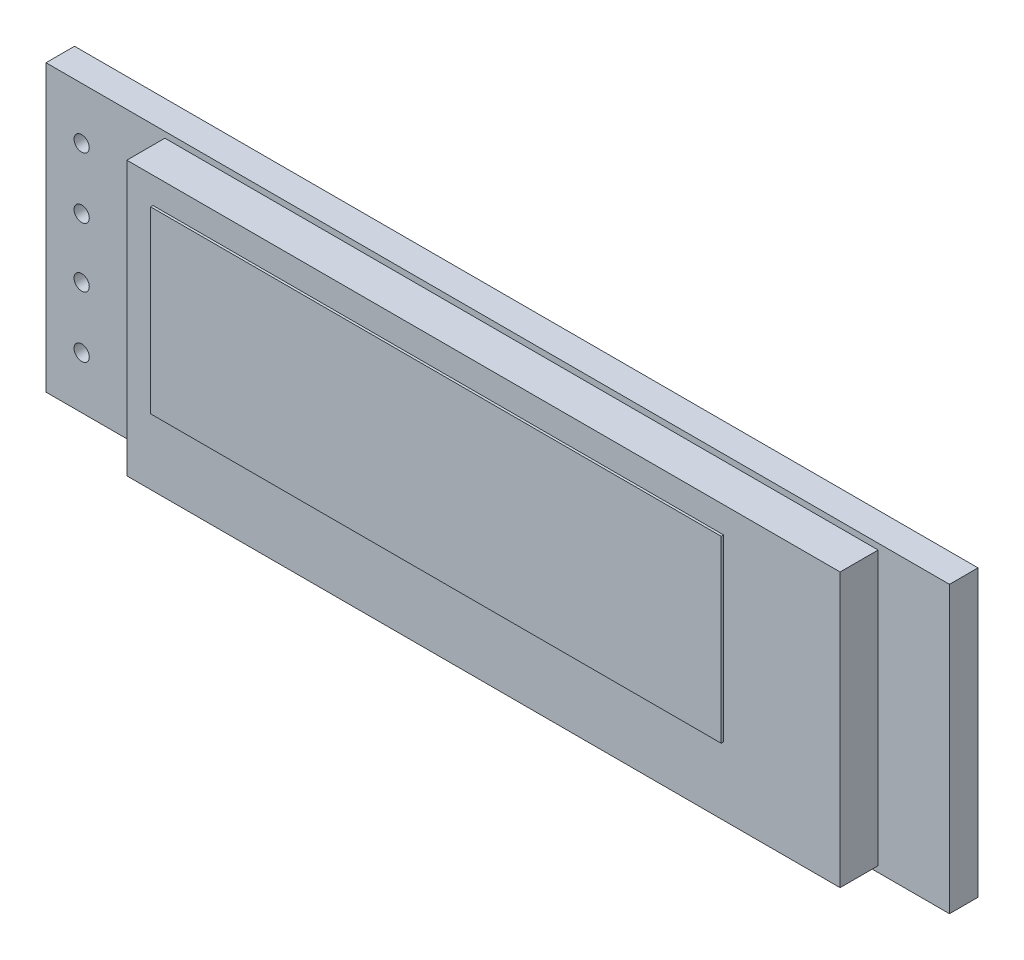
ISO-10303-21;
HEADER;
FILE_DESCRIPTION(('STEP AP214'),'2;1');
FILE_NAME('part.step','',(''),(''),'','','');
FILE_SCHEMA(('AUTOMOTIVE_DESIGN { 1 0 10303 214 1 1 1 1 }'));
ENDSEC;
DATA;
#1=APPLICATION_CONTEXT('core data for automotive mechanical design processes');
#2=APPLICATION_PROTOCOL_DEFINITION('international standard','automotive_design',2000,#1);
#3=PRODUCT_CONTEXT('',#1,'mechanical');
#4=PRODUCT('Part','Part','',(#3));
#5=PRODUCT_RELATED_PRODUCT_CATEGORY('part','',(#4));
#6=PRODUCT_DEFINITION_FORMATION('','',#4);
#7=PRODUCT_DEFINITION_CONTEXT('part definition',#1,'design');
#8=PRODUCT_DEFINITION('design','',#6,#7);
#9=PRODUCT_DEFINITION_SHAPE('','',#8);
#10=(LENGTH_UNIT() NAMED_UNIT(*) SI_UNIT(.MILLI.,.METRE.));
#11=(NAMED_UNIT(*) PLANE_ANGLE_UNIT() SI_UNIT($,.RADIAN.));
#12=(NAMED_UNIT(*) SI_UNIT($,.STERADIAN.) SOLID_ANGLE_UNIT());
#13=UNCERTAINTY_MEASURE_WITH_UNIT(LENGTH_MEASURE(1.E-05),#10,'distance_accuracy_value','');
#14=(GEOMETRIC_REPRESENTATION_CONTEXT(3) GLOBAL_UNCERTAINTY_ASSIGNED_CONTEXT((#13)) GLOBAL_UNIT_ASSIGNED_CONTEXT((#10,
#11,#12)) REPRESENTATION_CONTEXT('',''));
#15=CARTESIAN_POINT('',(0.,0.,0.));
#16=DIRECTION('',(0.,0.,1.));
#17=DIRECTION('',(1.,0.,0.));
#18=AXIS2_PLACEMENT_3D('',#15,#16,#17);
#19=CARTESIAN_POINT('',(0.,0.,2.8));
#20=DIRECTION('',(0.,0.,-1.));
#21=DIRECTION('',(-1.,0.,0.));
#22=AXIS2_PLACEMENT_3D('',#19,#20,#21);
#23=PLANE('',#22);
#24=DIRECTION('',(0.,1.,0.));
#25=VECTOR('',#24,1.);
#26=CARTESIAN_POINT('',(16.,-5.75,2.8));
#27=LINE('',#26,#25);
#28=CARTESIAN_POINT('',(16.,-5.75,2.8));
#29=VERTEX_POINT('',#28);
#30=CARTESIAN_POINT('',(16.,5.75,2.8));
#31=VERTEX_POINT('',#30);
#32=EDGE_CURVE('E165',#29,#31,#27,.T.);
#33=ORIENTED_EDGE('',*,*,#32,.T.);
#34=DIRECTION('',(-1.,0.,0.));
#35=VECTOR('',#34,1.);
#36=CARTESIAN_POINT('',(-14.,5.75,2.8));
#37=LINE('',#36,#35);
#38=CARTESIAN_POINT('',(-14.,5.75,2.8));
#39=VERTEX_POINT('',#38);
#40=EDGE_CURVE('E169',#31,#39,#37,.T.);
#41=ORIENTED_EDGE('',*,*,#40,.T.);
#42=DIRECTION('',(0.,-1.,0.));
#43=VECTOR('',#42,1.);
#44=CARTESIAN_POINT('',(-14.,-5.75,2.8));
#45=LINE('',#44,#43);
#46=CARTESIAN_POINT('',(-14.,-5.75,2.8));
#47=VERTEX_POINT('',#46);
#48=EDGE_CURVE('E173',#39,#47,#45,.T.);
#49=ORIENTED_EDGE('',*,*,#48,.T.);
#50=DIRECTION('',(1.,0.,0.));
#51=VECTOR('',#50,1.);
#52=CARTESIAN_POINT('',(-14.,-5.75,2.8));
#53=LINE('',#52,#51);
#54=EDGE_CURVE('E176',#47,#29,#53,.T.);
#55=ORIENTED_EDGE('',*,*,#54,.T.);
#56=EDGE_LOOP('',(#33,#41,#49,#55));
#57=FACE_BOUND('',#56,.T.);
#58=DIRECTION('',(0.,1.,0.));
#59=VECTOR('',#58,1.);
#60=CARTESIAN_POINT('',(11.1,4.65,2.8));
#61=LINE('',#60,#59);
#62=CARTESIAN_POINT('',(11.1,-2.89,2.8));
#63=VERTEX_POINT('',#62);
#64=CARTESIAN_POINT('',(11.1,4.65,2.8));
#65=VERTEX_POINT('',#64);
#66=EDGE_CURVE('E57',#63,#65,#61,.T.);
#67=ORIENTED_EDGE('',*,*,#66,.F.);
#68=DIRECTION('',(1.,0.,0.));
#69=VECTOR('',#68,1.);
#70=CARTESIAN_POINT('',(-12.9,-2.89,2.8));
#71=LINE('',#70,#69);
#72=CARTESIAN_POINT('',(-12.9,-2.89,2.8));
#73=VERTEX_POINT('',#72);
#74=EDGE_CURVE('E61',#73,#63,#71,.T.);
#75=ORIENTED_EDGE('',*,*,#74,.F.);
#76=DIRECTION('',(0.,-1.,0.));
#77=VECTOR('',#76,1.);
#78=CARTESIAN_POINT('',(-12.9,4.65,2.8));
#79=LINE('',#78,#77);
#80=CARTESIAN_POINT('',(-12.9,4.65,2.8));
#81=VERTEX_POINT('',#80);
#82=EDGE_CURVE('E488',#81,#73,#79,.T.);
#83=ORIENTED_EDGE('',*,*,#82,.F.);
#84=DIRECTION('',(-1.,0.,0.));
#85=VECTOR('',#84,1.);
#86=CARTESIAN_POINT('',(-12.9,4.65,2.8));
#87=LINE('',#86,#85);
#88=EDGE_CURVE('E453',#65,#81,#87,.T.);
#89=ORIENTED_EDGE('',*,*,#88,.F.);
#90=EDGE_LOOP('',(#67,#75,#83,#89));
#91=FACE_BOUND('',#90,.T.);
#92=ADVANCED_FACE('F41',(#57,#91),#23,.F.);
#93=CARTESIAN_POINT('',(-19.,-6.,1.2));
#94=DIRECTION('',(1.,0.,0.));
#95=DIRECTION('',(0.,0.,-1.));
#96=AXIS2_PLACEMENT_3D('',#93,#94,#95);
#97=PLANE('',#96);
#98=DIRECTION('',(0.,-1.,0.));
#99=VECTOR('',#98,1.);
#100=CARTESIAN_POINT('',(-19.,-6.,0.));
#101=LINE('',#100,#99);
#102=CARTESIAN_POINT('',(-19.,6.,0.));
#103=VERTEX_POINT('',#102);
#104=CARTESIAN_POINT('',(-19.,-6.,0.));
#105=VERTEX_POINT('',#104);
#106=EDGE_CURVE('E205',#103,#105,#101,.T.);
#107=ORIENTED_EDGE('',*,*,#106,.T.);
#108=DIRECTION('',(0.,0.,-1.));
#109=VECTOR('',#108,1.);
#110=CARTESIAN_POINT('',(-19.,-6.,1.2));
#111=LINE('',#110,#109);
#112=CARTESIAN_POINT('',(-19.,-6.,1.2));
#113=VERTEX_POINT('',#112);
#114=EDGE_CURVE('E11',#113,#105,#111,.T.);
#115=ORIENTED_EDGE('',*,*,#114,.F.);
#116=DIRECTION('',(0.,-1.,0.));
#117=VECTOR('',#116,1.);
#118=CARTESIAN_POINT('',(-19.,-6.,1.2));
#119=LINE('',#118,#117);
#120=CARTESIAN_POINT('',(-19.,6.,1.2));
#121=VERTEX_POINT('',#120);
#122=EDGE_CURVE('E206',#121,#113,#119,.T.);
#123=ORIENTED_EDGE('',*,*,#122,.F.);
#124=DIRECTION('',(0.,0.,-1.));
#125=VECTOR('',#124,1.);
#126=CARTESIAN_POINT('',(-19.,6.,1.2));
#127=LINE('',#126,#125);
#128=EDGE_CURVE('E220',#121,#103,#127,.T.);
#129=ORIENTED_EDGE('',*,*,#128,.T.);
#130=EDGE_LOOP('',(#107,#115,#123,#129));
#131=FACE_BOUND('',#130,.T.);
#132=ADVANCED_FACE('F43',(#131),#97,.F.);
#133=CARTESIAN_POINT('',(19.,-6.,1.2));
#134=DIRECTION('',(0.,1.,0.));
#135=DIRECTION('',(-1.,0.,0.));
#136=AXIS2_PLACEMENT_3D('',#133,#134,#135);
#137=PLANE('',#136);
#138=DIRECTION('',(1.,0.,0.));
#139=VECTOR('',#138,1.);
#140=CARTESIAN_POINT('',(19.,-6.,0.));
#141=LINE('',#140,#139);
#142=CARTESIAN_POINT('',(19.,-6.,0.));
#143=VERTEX_POINT('',#142);
#144=EDGE_CURVE('E224',#105,#143,#141,.T.);
#145=ORIENTED_EDGE('',*,*,#144,.T.);
#146=DIRECTION('',(0.,0.,-1.));
#147=VECTOR('',#146,1.);
#148=CARTESIAN_POINT('',(19.,-6.,1.2));
#149=LINE('',#148,#147);
#150=CARTESIAN_POINT('',(19.,-6.,1.2));
#151=VERTEX_POINT('',#150);
#152=EDGE_CURVE('E50',#151,#143,#149,.T.);
#153=ORIENTED_EDGE('',*,*,#152,.F.);
#154=DIRECTION('',(1.,0.,0.));
#155=VECTOR('',#154,1.);
#156=CARTESIAN_POINT('',(19.,-6.,1.2));
#157=LINE('',#156,#155);
#158=EDGE_CURVE('E210',#113,#151,#157,.T.);
#159=ORIENTED_EDGE('',*,*,#158,.F.);
#160=ORIENTED_EDGE('',*,*,#114,.T.);
#161=EDGE_LOOP('',(#145,#153,#159,#160));
#162=FACE_BOUND('',#161,.T.);
#163=ADVANCED_FACE('F260',(#162),#137,.F.);
#164=CARTESIAN_POINT('',(19.,-6.,1.2));
#165=DIRECTION('',(-1.,0.,0.));
#166=DIRECTION('',(0.,0.,1.));
#167=AXIS2_PLACEMENT_3D('',#164,#165,#166);
#168=PLANE('',#167);
#169=DIRECTION('',(0.,1.,0.));
#170=VECTOR('',#169,1.);
#171=CARTESIAN_POINT('',(19.,-6.,0.));
#172=LINE('',#171,#170);
#173=CARTESIAN_POINT('',(19.,6.,0.));
#174=VERTEX_POINT('',#173);
#175=EDGE_CURVE('E227',#143,#174,#172,.T.);
#176=ORIENTED_EDGE('',*,*,#175,.T.);
#177=DIRECTION('',(0.,0.,-1.));
#178=VECTOR('',#177,1.);
#179=CARTESIAN_POINT('',(19.,6.,1.2));
#180=LINE('',#179,#178);
#181=CARTESIAN_POINT('',(19.,6.,1.2));
#182=VERTEX_POINT('',#181);
#183=EDGE_CURVE('E235',#182,#174,#180,.T.);
#184=ORIENTED_EDGE('',*,*,#183,.F.);
#185=DIRECTION('',(0.,1.,0.));
#186=VECTOR('',#185,1.);
#187=CARTESIAN_POINT('',(19.,-6.,1.2));
#188=LINE('',#187,#186);
#189=EDGE_CURVE('E214',#151,#182,#188,.T.);
#190=ORIENTED_EDGE('',*,*,#189,.F.);
#191=ORIENTED_EDGE('',*,*,#152,.T.);
#192=EDGE_LOOP('',(#176,#184,#190,#191));
#193=FACE_BOUND('',#192,.T.);
#194=ADVANCED_FACE('F244',(#193),#168,.F.);
#195=CARTESIAN_POINT('',(19.,6.,1.2));
#196=DIRECTION('',(0.,-1.,0.));
#197=DIRECTION('',(1.,0.,0.));
#198=AXIS2_PLACEMENT_3D('',#195,#196,#197);
#199=PLANE('',#198);
#200=DIRECTION('',(-1.,0.,0.));
#201=VECTOR('',#200,1.);
#202=CARTESIAN_POINT('',(19.,6.,0.));
#203=LINE('',#202,#201);
#204=EDGE_CURVE('E211',#174,#103,#203,.T.);
#205=ORIENTED_EDGE('',*,*,#204,.T.);
#206=ORIENTED_EDGE('',*,*,#128,.F.);
#207=DIRECTION('',(-1.,0.,0.));
#208=VECTOR('',#207,1.);
#209=CARTESIAN_POINT('',(19.,6.,1.2));
#210=LINE('',#209,#208);
#211=EDGE_CURVE('E217',#182,#121,#210,.T.);
#212=ORIENTED_EDGE('',*,*,#211,.F.);
#213=ORIENTED_EDGE('',*,*,#183,.T.);
#214=EDGE_LOOP('',(#205,#206,#212,#213));
#215=FACE_BOUND('',#214,.T.);
#216=ADVANCED_FACE('F253',(#215),#199,.F.);
#217=CARTESIAN_POINT('',(0.,0.,1.2));
#218=DIRECTION('',(0.,0.,1.));
#219=DIRECTION('',(1.,0.,0.));
#220=AXIS2_PLACEMENT_3D('',#217,#218,#219);
#221=PLANE('',#220);
#222=CARTESIAN_POINT('',(-17.5,3.81,1.2));
#223=DIRECTION('',(0.,0.,1.));
#224=DIRECTION('',(1.,0.,0.));
#225=AXIS2_PLACEMENT_3D('',#222,#223,#224);
#226=CIRCLE('',#225,0.32);
#227=CARTESIAN_POINT('',(-17.18,3.81,1.2));
#228=VERTEX_POINT('',#227);
#229=EDGE_CURVE('E448',#228,#228,#226,.F.);
#230=ORIENTED_EDGE('',*,*,#229,.T.);
#231=EDGE_LOOP('',(#230));
#232=FACE_BOUND('',#231,.T.);
#233=CARTESIAN_POINT('',(-17.5,1.25,1.2));
#234=DIRECTION('',(0.,0.,1.));
#235=DIRECTION('',(1.,0.,0.));
#236=AXIS2_PLACEMENT_3D('',#233,#234,#235);
#237=CIRCLE('',#236,0.32);
#238=CARTESIAN_POINT('',(-17.18,1.25,1.2));
#239=VERTEX_POINT('',#238);
#240=EDGE_CURVE('E455',#239,#239,#237,.F.);
#241=ORIENTED_EDGE('',*,*,#240,.T.);
#242=EDGE_LOOP('',(#241));
#243=FACE_BOUND('',#242,.T.);
#244=CARTESIAN_POINT('',(-17.5,-1.25,1.2));
#245=DIRECTION('',(0.,0.,1.));
#246=DIRECTION('',(1.,0.,0.));
#247=AXIS2_PLACEMENT_3D('',#244,#245,#246);
#248=CIRCLE('',#247,0.32);
#249=CARTESIAN_POINT('',(-17.18,-1.25,1.2));
#250=VERTEX_POINT('',#249);
#251=EDGE_CURVE('E462',#250,#250,#248,.F.);
#252=ORIENTED_EDGE('',*,*,#251,.T.);
#253=EDGE_LOOP('',(#252));
#254=FACE_BOUND('',#253,.T.);
#255=CARTESIAN_POINT('',(-17.5,-3.81,1.2));
#256=DIRECTION('',(0.,0.,1.));
#257=DIRECTION('',(1.,0.,0.));
#258=AXIS2_PLACEMENT_3D('',#255,#256,#257);
#259=CIRCLE('',#258,0.32);
#260=CARTESIAN_POINT('',(-17.18,-3.81,1.2));
#261=VERTEX_POINT('',#260);
#262=EDGE_CURVE('E470',#261,#261,#259,.F.);
#263=ORIENTED_EDGE('',*,*,#262,.T.);
#264=EDGE_LOOP('',(#263));
#265=FACE_BOUND('',#264,.T.);
#266=DIRECTION('',(0.,1.,0.));
#267=VECTOR('',#266,1.);
#268=CARTESIAN_POINT('',(16.,-5.75,1.2));
#269=LINE('',#268,#267);
#270=CARTESIAN_POINT('',(16.,-5.75,1.2));
#271=VERTEX_POINT('',#270);
#272=CARTESIAN_POINT('',(16.,5.75,1.2));
#273=VERTEX_POINT('',#272);
#274=EDGE_CURVE('E154',#271,#273,#269,.T.);
#275=ORIENTED_EDGE('',*,*,#274,.F.);
#276=DIRECTION('',(1.,0.,0.));
#277=VECTOR('',#276,1.);
#278=CARTESIAN_POINT('',(-14.,-5.75,1.2));
#279=LINE('',#278,#277);
#280=CARTESIAN_POINT('',(-14.,-5.75,1.2));
#281=VERTEX_POINT('',#280);
#282=EDGE_CURVE('E170',#281,#271,#279,.T.);
#283=ORIENTED_EDGE('',*,*,#282,.F.);
#284=DIRECTION('',(0.,-1.,0.));
#285=VECTOR('',#284,1.);
#286=CARTESIAN_POINT('',(-14.,-5.75,1.2));
#287=LINE('',#286,#285);
#288=CARTESIAN_POINT('',(-14.,5.75,1.2));
#289=VERTEX_POINT('',#288);
#290=EDGE_CURVE('E183',#289,#281,#287,.T.);
#291=ORIENTED_EDGE('',*,*,#290,.F.);
#292=DIRECTION('',(-1.,0.,0.));
#293=VECTOR('',#292,1.);
#294=CARTESIAN_POINT('',(-14.,5.75,1.2));
#295=LINE('',#294,#293);
#296=EDGE_CURVE('E159',#273,#289,#295,.T.);
#297=ORIENTED_EDGE('',*,*,#296,.F.);
#298=EDGE_LOOP('',(#275,#283,#291,#297));
#299=FACE_BOUND('',#298,.T.);
#300=ORIENTED_EDGE('',*,*,#122,.T.);
#301=ORIENTED_EDGE('',*,*,#158,.T.);
#302=ORIENTED_EDGE('',*,*,#189,.T.);
#303=ORIENTED_EDGE('',*,*,#211,.T.);
#304=EDGE_LOOP('',(#300,#301,#302,#303));
#305=FACE_BOUND('',#304,.T.);
#306=ADVANCED_FACE('F259',(#232,#243,#254,#265,#299,#305),#221,.T.);
#307=CARTESIAN_POINT('',(0.,0.,0.));
#308=DIRECTION('',(0.,0.,1.));
#309=DIRECTION('',(1.,0.,0.));
#310=AXIS2_PLACEMENT_3D('',#307,#308,#309);
#311=PLANE('',#310);
#312=CARTESIAN_POINT('',(-17.5,3.81,0.));
#313=DIRECTION('',(0.,0.,-1.));
#314=DIRECTION('',(-1.,0.,0.));
#315=AXIS2_PLACEMENT_3D('',#312,#313,#314);
#316=CIRCLE('',#315,0.32);
#317=CARTESIAN_POINT('',(-17.82,3.81,0.));
#318=VERTEX_POINT('',#317);
#319=EDGE_CURVE('E445',#318,#318,#316,.T.);
#320=ORIENTED_EDGE('',*,*,#319,.F.);
#321=EDGE_LOOP('',(#320));
#322=FACE_BOUND('',#321,.T.);
#323=CARTESIAN_POINT('',(-17.5,1.25,0.));
#324=DIRECTION('',(0.,0.,-1.));
#325=DIRECTION('',(-1.,0.,0.));
#326=AXIS2_PLACEMENT_3D('',#323,#324,#325);
#327=CIRCLE('',#326,0.32);
#328=CARTESIAN_POINT('',(-17.82,1.25,0.));
#329=VERTEX_POINT('',#328);
#330=EDGE_CURVE('E458',#329,#329,#327,.T.);
#331=ORIENTED_EDGE('',*,*,#330,.F.);
#332=EDGE_LOOP('',(#331));
#333=FACE_BOUND('',#332,.T.);
#334=CARTESIAN_POINT('',(-17.5,-1.25,0.));
#335=DIRECTION('',(0.,0.,-1.));
#336=DIRECTION('',(-1.,0.,0.));
#337=AXIS2_PLACEMENT_3D('',#334,#335,#336);
#338=CIRCLE('',#337,0.32);
#339=CARTESIAN_POINT('',(-17.82,-1.25,0.));
#340=VERTEX_POINT('',#339);
#341=EDGE_CURVE('E466',#340,#340,#338,.T.);
#342=ORIENTED_EDGE('',*,*,#341,.F.);
#343=EDGE_LOOP('',(#342));
#344=FACE_BOUND('',#343,.T.);
#345=CARTESIAN_POINT('',(-17.5,-3.81,0.));
#346=DIRECTION('',(0.,0.,-1.));
#347=DIRECTION('',(-1.,0.,0.));
#348=AXIS2_PLACEMENT_3D('',#345,#346,#347);
#349=CIRCLE('',#348,0.32);
#350=CARTESIAN_POINT('',(-17.82,-3.81,0.));
#351=VERTEX_POINT('',#350);
#352=EDGE_CURVE('E474',#351,#351,#349,.T.);
#353=ORIENTED_EDGE('',*,*,#352,.F.);
#354=EDGE_LOOP('',(#353));
#355=FACE_BOUND('',#354,.T.);
#356=ORIENTED_EDGE('',*,*,#106,.F.);
#357=ORIENTED_EDGE('',*,*,#204,.F.);
#358=ORIENTED_EDGE('',*,*,#175,.F.);
#359=ORIENTED_EDGE('',*,*,#144,.F.);
#360=EDGE_LOOP('',(#356,#357,#358,#359));
#361=FACE_BOUND('',#360,.T.);
#362=ADVANCED_FACE('F250',(#322,#333,#344,#355,#361),#311,.F.);
#363=CARTESIAN_POINT('',(16.,-5.75,2.8));
#364=DIRECTION('',(-1.,0.,0.));
#365=DIRECTION('',(0.,0.,1.));
#366=AXIS2_PLACEMENT_3D('',#363,#364,#365);
#367=PLANE('',#366);
#368=ORIENTED_EDGE('',*,*,#274,.T.);
#369=DIRECTION('',(0.,0.,-1.));
#370=VECTOR('',#369,1.);
#371=CARTESIAN_POINT('',(16.,5.75,2.8));
#372=LINE('',#371,#370);
#373=EDGE_CURVE('E201',#31,#273,#372,.T.);
#374=ORIENTED_EDGE('',*,*,#373,.F.);
#375=ORIENTED_EDGE('',*,*,#32,.F.);
#376=DIRECTION('',(0.,0.,-1.));
#377=VECTOR('',#376,1.);
#378=CARTESIAN_POINT('',(16.,-5.75,2.8));
#379=LINE('',#378,#377);
#380=EDGE_CURVE('E178',#29,#271,#379,.T.);
#381=ORIENTED_EDGE('',*,*,#380,.T.);
#382=EDGE_LOOP('',(#368,#374,#375,#381));
#383=FACE_BOUND('',#382,.T.);
#384=ADVANCED_FACE('F286',(#383),#367,.F.);
#385=CARTESIAN_POINT('',(-14.,5.75,2.8));
#386=DIRECTION('',(0.,-1.,0.));
#387=DIRECTION('',(0.,0.,-1.));
#388=AXIS2_PLACEMENT_3D('',#385,#386,#387);
#389=PLANE('',#388);
#390=ORIENTED_EDGE('',*,*,#296,.T.);
#391=DIRECTION('',(0.,0.,-1.));
#392=VECTOR('',#391,1.);
#393=CARTESIAN_POINT('',(-14.,5.75,2.8));
#394=LINE('',#393,#392);
#395=EDGE_CURVE('E197',#39,#289,#394,.T.);
#396=ORIENTED_EDGE('',*,*,#395,.F.);
#397=ORIENTED_EDGE('',*,*,#40,.F.);
#398=ORIENTED_EDGE('',*,*,#373,.T.);
#399=EDGE_LOOP('',(#390,#396,#397,#398));
#400=FACE_BOUND('',#399,.T.);
#401=ADVANCED_FACE('F282',(#400),#389,.F.);
#402=CARTESIAN_POINT('',(-14.,-5.75,2.8));
#403=DIRECTION('',(1.,0.,0.));
#404=DIRECTION('',(0.,0.,-1.));
#405=AXIS2_PLACEMENT_3D('',#402,#403,#404);
#406=PLANE('',#405);
#407=ORIENTED_EDGE('',*,*,#290,.T.);
#408=DIRECTION('',(0.,0.,-1.));
#409=VECTOR('',#408,1.);
#410=CARTESIAN_POINT('',(-14.,-5.75,2.8));
#411=LINE('',#410,#409);
#412=EDGE_CURVE('E193',#47,#281,#411,.T.);
#413=ORIENTED_EDGE('',*,*,#412,.F.);
#414=ORIENTED_EDGE('',*,*,#48,.F.);
#415=ORIENTED_EDGE('',*,*,#395,.T.);
#416=EDGE_LOOP('',(#407,#413,#414,#415));
#417=FACE_BOUND('',#416,.T.);
#418=ADVANCED_FACE('F278',(#417),#406,.F.);
#419=CARTESIAN_POINT('',(-14.,-5.75,2.8));
#420=DIRECTION('',(0.,1.,0.));
#421=DIRECTION('',(0.,0.,1.));
#422=AXIS2_PLACEMENT_3D('',#419,#420,#421);
#423=PLANE('',#422);
#424=ORIENTED_EDGE('',*,*,#282,.T.);
#425=ORIENTED_EDGE('',*,*,#380,.F.);
#426=ORIENTED_EDGE('',*,*,#54,.F.);
#427=ORIENTED_EDGE('',*,*,#412,.T.);
#428=EDGE_LOOP('',(#424,#425,#426,#427));
#429=FACE_BOUND('',#428,.T.);
#430=ADVANCED_FACE('F275',(#429),#423,.F.);
#431=CARTESIAN_POINT('',(11.1,4.65,2.9));
#432=DIRECTION('',(-1.,0.,0.));
#433=DIRECTION('',(0.,-1.,0.));
#434=AXIS2_PLACEMENT_3D('',#431,#432,#433);
#435=PLANE('',#434);
#436=ORIENTED_EDGE('',*,*,#66,.T.);
#437=DIRECTION('',(0.,0.,-1.));
#438=VECTOR('',#437,1.);
#439=CARTESIAN_POINT('',(11.1,4.65,2.9));
#440=LINE('',#439,#438);
#441=CARTESIAN_POINT('',(11.1,4.65,2.9));
#442=VERTEX_POINT('',#441);
#443=EDGE_CURVE('E134',#442,#65,#440,.T.);
#444=ORIENTED_EDGE('',*,*,#443,.F.);
#445=DIRECTION('',(0.,1.,0.));
#446=VECTOR('',#445,1.);
#447=CARTESIAN_POINT('',(11.1,4.65,2.9));
#448=LINE('',#447,#446);
#449=CARTESIAN_POINT('',(11.1,-2.89,2.9));
#450=VERTEX_POINT('',#449);
#451=EDGE_CURVE('E141',#450,#442,#448,.T.);
#452=ORIENTED_EDGE('',*,*,#451,.F.);
#453=DIRECTION('',(0.,0.,-1.));
#454=VECTOR('',#453,1.);
#455=CARTESIAN_POINT('',(11.1,-2.89,2.9));
#456=LINE('',#455,#454);
#457=EDGE_CURVE('E484',#450,#63,#456,.T.);
#458=ORIENTED_EDGE('',*,*,#457,.T.);
#459=EDGE_LOOP('',(#436,#444,#452,#458));
#460=FACE_BOUND('',#459,.T.);
#461=ADVANCED_FACE('F152',(#460),#435,.F.);
#462=CARTESIAN_POINT('',(-12.9,4.65,2.9));
#463=DIRECTION('',(0.,-1.,0.));
#464=DIRECTION('',(0.,0.,-1.));
#465=AXIS2_PLACEMENT_3D('',#462,#463,#464);
#466=PLANE('',#465);
#467=ORIENTED_EDGE('',*,*,#88,.T.);
#468=DIRECTION('',(0.,0.,-1.));
#469=VECTOR('',#468,1.);
#470=CARTESIAN_POINT('',(-12.9,4.65,2.9));
#471=LINE('',#470,#469);
#472=CARTESIAN_POINT('',(-12.9,4.65,2.9));
#473=VERTEX_POINT('',#472);
#474=EDGE_CURVE('E136',#473,#81,#471,.T.);
#475=ORIENTED_EDGE('',*,*,#474,.F.);
#476=DIRECTION('',(-1.,0.,0.));
#477=VECTOR('',#476,1.);
#478=CARTESIAN_POINT('',(-12.9,4.65,2.9));
#479=LINE('',#478,#477);
#480=EDGE_CURVE('E129',#442,#473,#479,.T.);
#481=ORIENTED_EDGE('',*,*,#480,.F.);
#482=ORIENTED_EDGE('',*,*,#443,.T.);
#483=EDGE_LOOP('',(#467,#475,#481,#482));
#484=FACE_BOUND('',#483,.T.);
#485=ADVANCED_FACE('F132',(#484),#466,.F.);
#486=CARTESIAN_POINT('',(-12.9,4.65,2.9));
#487=DIRECTION('',(1.,0.,0.));
#488=DIRECTION('',(0.,0.,-1.));
#489=AXIS2_PLACEMENT_3D('',#486,#487,#488);
#490=PLANE('',#489);
#491=ORIENTED_EDGE('',*,*,#82,.T.);
#492=DIRECTION('',(0.,0.,-1.));
#493=VECTOR('',#492,1.);
#494=CARTESIAN_POINT('',(-12.9,-2.89,2.9));
#495=LINE('',#494,#493);
#496=CARTESIAN_POINT('',(-12.9,-2.89,2.9));
#497=VERTEX_POINT('',#496);
#498=EDGE_CURVE('E161',#497,#73,#495,.T.);
#499=ORIENTED_EDGE('',*,*,#498,.F.);
#500=DIRECTION('',(0.,-1.,0.));
#501=VECTOR('',#500,1.);
#502=CARTESIAN_POINT('',(-12.9,4.65,2.9));
#503=LINE('',#502,#501);
#504=EDGE_CURVE('E140',#473,#497,#503,.T.);
#505=ORIENTED_EDGE('',*,*,#504,.F.);
#506=ORIENTED_EDGE('',*,*,#474,.T.);
#507=EDGE_LOOP('',(#491,#499,#505,#506));
#508=FACE_BOUND('',#507,.T.);
#509=ADVANCED_FACE('F339',(#508),#490,.F.);
#510=CARTESIAN_POINT('',(-12.9,-2.89,2.9));
#511=DIRECTION('',(0.,1.,0.));
#512=DIRECTION('',(0.,0.,1.));
#513=AXIS2_PLACEMENT_3D('',#510,#511,#512);
#514=PLANE('',#513);
#515=ORIENTED_EDGE('',*,*,#74,.T.);
#516=ORIENTED_EDGE('',*,*,#457,.F.);
#517=DIRECTION('',(1.,0.,0.));
#518=VECTOR('',#517,1.);
#519=CARTESIAN_POINT('',(-12.9,-2.89,2.9));
#520=LINE('',#519,#518);
#521=EDGE_CURVE('E146',#497,#450,#520,.T.);
#522=ORIENTED_EDGE('',*,*,#521,.F.);
#523=ORIENTED_EDGE('',*,*,#498,.T.);
#524=EDGE_LOOP('',(#515,#516,#522,#523));
#525=FACE_BOUND('',#524,.T.);
#526=ADVANCED_FACE('F345',(#525),#514,.F.);
#527=CARTESIAN_POINT('',(0.,0.,2.9));
#528=DIRECTION('',(0.,0.,1.));
#529=DIRECTION('',(1.,0.,0.));
#530=AXIS2_PLACEMENT_3D('',#527,#528,#529);
#531=PLANE('',#530);
#532=ORIENTED_EDGE('',*,*,#451,.T.);
#533=ORIENTED_EDGE('',*,*,#480,.T.);
#534=ORIENTED_EDGE('',*,*,#504,.T.);
#535=ORIENTED_EDGE('',*,*,#521,.T.);
#536=EDGE_LOOP('',(#532,#533,#534,#535));
#537=FACE_BOUND('',#536,.T.);
#538=ADVANCED_FACE('F144',(#537),#531,.T.);
#539=CARTESIAN_POINT('',(-17.5,-3.81,2.10509667991878));
#540=DIRECTION('',(0.,0.,-1.));
#541=DIRECTION('',(-1.,0.,0.));
#542=AXIS2_PLACEMENT_3D('',#539,#540,#541);
#543=CYLINDRICAL_SURFACE('',#542,0.32);
#544=ORIENTED_EDGE('',*,*,#352,.T.);
#545=EDGE_LOOP('',(#544));
#546=FACE_BOUND('',#545,.T.);
#547=ORIENTED_EDGE('',*,*,#262,.F.);
#548=EDGE_LOOP('',(#547));
#549=FACE_BOUND('',#548,.T.);
#550=ADVANCED_FACE('F359',(#546,#549),#543,.F.);
#551=CARTESIAN_POINT('',(-17.5,-1.25,2.10509667991878));
#552=DIRECTION('',(0.,0.,-1.));
#553=DIRECTION('',(-1.,0.,0.));
#554=AXIS2_PLACEMENT_3D('',#551,#552,#553);
#555=CYLINDRICAL_SURFACE('',#554,0.32);
#556=ORIENTED_EDGE('',*,*,#341,.T.);
#557=EDGE_LOOP('',(#556));
#558=FACE_BOUND('',#557,.T.);
#559=ORIENTED_EDGE('',*,*,#251,.F.);
#560=EDGE_LOOP('',(#559));
#561=FACE_BOUND('',#560,.T.);
#562=ADVANCED_FACE('F365',(#558,#561),#555,.F.);
#563=CARTESIAN_POINT('',(-17.5,1.25,2.10509667991878));
#564=DIRECTION('',(0.,0.,-1.));
#565=DIRECTION('',(-1.,0.,0.));
#566=AXIS2_PLACEMENT_3D('',#563,#564,#565);
#567=CYLINDRICAL_SURFACE('',#566,0.32);
#568=ORIENTED_EDGE('',*,*,#330,.T.);
#569=EDGE_LOOP('',(#568));
#570=FACE_BOUND('',#569,.T.);
#571=ORIENTED_EDGE('',*,*,#240,.F.);
#572=EDGE_LOOP('',(#571));
#573=FACE_BOUND('',#572,.T.);
#574=ADVANCED_FACE('F373',(#570,#573),#567,.F.);
#575=CARTESIAN_POINT('',(-17.5,3.81,2.10509667991878));
#576=DIRECTION('',(0.,0.,-1.));
#577=DIRECTION('',(-1.,0.,0.));
#578=AXIS2_PLACEMENT_3D('',#575,#576,#577);
#579=CYLINDRICAL_SURFACE('',#578,0.32);
#580=ORIENTED_EDGE('',*,*,#319,.T.);
#581=EDGE_LOOP('',(#580));
#582=FACE_BOUND('',#581,.T.);
#583=ORIENTED_EDGE('',*,*,#229,.F.);
#584=EDGE_LOOP('',(#583));
#585=FACE_BOUND('',#584,.T.);
#586=ADVANCED_FACE('F381',(#582,#585),#579,.F.);
#587=CLOSED_SHELL('',(#92,#132,#163,#194,#216,#306,#362,#384,#401,#418,#430,#461,#485,#509,#526,
#538,#550,#562,#574,#586));
#588=MANIFOLD_SOLID_BREP('B2',#587);
#589=ADVANCED_BREP_SHAPE_REPRESENTATION('',(#18,#588),#14);
#590=SHAPE_DEFINITION_REPRESENTATION(#9,#589);
ENDSEC;
END-ISO-10303-21;
